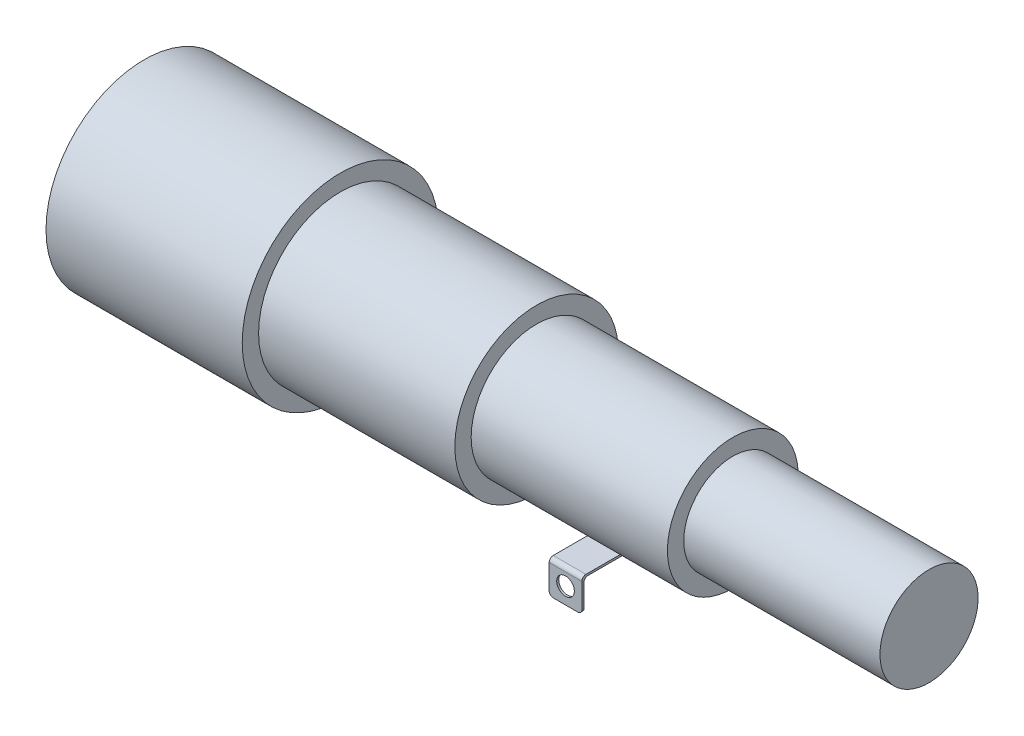
ISO-10303-21;
HEADER;
FILE_DESCRIPTION(('STEP AP214'),'2;1');
FILE_NAME('part.step','',(''),(''),'','','');
FILE_SCHEMA(('AUTOMOTIVE_DESIGN { 1 0 10303 214 1 1 1 1 }'));
ENDSEC;
DATA;
#1=APPLICATION_CONTEXT('core data for automotive mechanical design processes');
#2=APPLICATION_PROTOCOL_DEFINITION('international standard','automotive_design',2000,#1);
#3=PRODUCT_CONTEXT('',#1,'mechanical');
#4=PRODUCT('Part','Part','',(#3));
#5=PRODUCT_RELATED_PRODUCT_CATEGORY('part','',(#4));
#6=PRODUCT_DEFINITION_FORMATION('','',#4);
#7=PRODUCT_DEFINITION_CONTEXT('part definition',#1,'design');
#8=PRODUCT_DEFINITION('design','',#6,#7);
#9=PRODUCT_DEFINITION_SHAPE('','',#8);
#10=(LENGTH_UNIT() NAMED_UNIT(*) SI_UNIT(.MILLI.,.METRE.));
#11=(NAMED_UNIT(*) PLANE_ANGLE_UNIT() SI_UNIT($,.RADIAN.));
#12=(NAMED_UNIT(*) SI_UNIT($,.STERADIAN.) SOLID_ANGLE_UNIT());
#13=UNCERTAINTY_MEASURE_WITH_UNIT(LENGTH_MEASURE(1.E-05),#10,'distance_accuracy_value','');
#14=(GEOMETRIC_REPRESENTATION_CONTEXT(3) GLOBAL_UNCERTAINTY_ASSIGNED_CONTEXT((#13)) GLOBAL_UNIT_ASSIGNED_CONTEXT((#10,
#11,#12)) REPRESENTATION_CONTEXT('',''));
#15=CARTESIAN_POINT('',(0.,0.,0.));
#16=DIRECTION('',(0.,0.,1.));
#17=DIRECTION('',(1.,0.,0.));
#18=AXIS2_PLACEMENT_3D('',#15,#16,#17);
#19=CARTESIAN_POINT('',(730.633019333322,-104.775,98.298));
#20=DIRECTION('',(0.,0.,1.));
#21=DIRECTION('',(0.,-1.,0.));
#22=AXIS2_PLACEMENT_3D('',#19,#20,#21);
#23=PLANE('',#22);
#24=CARTESIAN_POINT('',(756.033019333322,-127.,98.2979999999999));
#25=DIRECTION('',(0.,0.,1.));
#26=DIRECTION('',(0.,-1.,0.));
#27=AXIS2_PLACEMENT_3D('',#24,#25,#26);
#28=CIRCLE('',#27,13.716);
#29=CARTESIAN_POINT('',(756.033019333322,-140.716,98.2979999999999));
#30=VERTEX_POINT('',#29);
#31=EDGE_CURVE('E328',#30,#30,#28,.T.);
#32=ORIENTED_EDGE('',*,*,#31,.T.);
#33=EDGE_LOOP('',(#32));
#34=FACE_BOUND('',#33,.T.);
#35=DIRECTION('',(0.,-1.,0.));
#36=VECTOR('',#35,1.);
#37=CARTESIAN_POINT('',(781.433019333322,-104.775,98.298));
#38=LINE('',#37,#36);
#39=CARTESIAN_POINT('',(781.433019333322,-111.125,98.298));
#40=VERTEX_POINT('',#39);
#41=CARTESIAN_POINT('',(781.433019333322,-146.05,98.2979999999999));
#42=VERTEX_POINT('',#41);
#43=EDGE_CURVE('E302',#40,#42,#38,.T.);
#44=ORIENTED_EDGE('',*,*,#43,.T.);
#45=CARTESIAN_POINT('',(775.083019333322,-146.05,98.2979999999999));
#46=DIRECTION('',(0.,0.,1.));
#47=DIRECTION('',(0.,-1.,0.));
#48=AXIS2_PLACEMENT_3D('',#45,#46,#47);
#49=CIRCLE('',#48,6.35);
#50=CARTESIAN_POINT('',(775.083019333322,-152.4,98.2979999999999));
#51=VERTEX_POINT('',#50);
#52=EDGE_CURVE('E357',#42,#51,#49,.F.);
#53=ORIENTED_EDGE('',*,*,#52,.T.);
#54=DIRECTION('',(1.,0.,0.));
#55=VECTOR('',#54,1.);
#56=CARTESIAN_POINT('',(730.633019333322,-152.4,98.2979999999999));
#57=LINE('',#56,#55);
#58=CARTESIAN_POINT('',(736.983019333322,-152.4,98.2979999999999));
#59=VERTEX_POINT('',#58);
#60=EDGE_CURVE('E235',#59,#51,#57,.T.);
#61=ORIENTED_EDGE('',*,*,#60,.F.);
#62=CARTESIAN_POINT('',(736.983019333322,-146.05,98.2979999999999));
#63=DIRECTION('',(0.,0.,1.));
#64=DIRECTION('',(0.,-1.,0.));
#65=AXIS2_PLACEMENT_3D('',#62,#63,#64);
#66=CIRCLE('',#65,6.35);
#67=CARTESIAN_POINT('',(730.633019333322,-146.05,98.2979999999999));
#68=VERTEX_POINT('',#67);
#69=EDGE_CURVE('E352',#59,#68,#66,.F.);
#70=ORIENTED_EDGE('',*,*,#69,.T.);
#71=DIRECTION('',(0.,-1.,0.));
#72=VECTOR('',#71,1.);
#73=CARTESIAN_POINT('',(730.633019333322,-104.775,98.298));
#74=LINE('',#73,#72);
#75=CARTESIAN_POINT('',(730.633019333322,-111.125,98.298));
#76=VERTEX_POINT('',#75);
#77=EDGE_CURVE('E336',#76,#68,#74,.T.);
#78=ORIENTED_EDGE('',*,*,#77,.F.);
#79=DIRECTION('',(1.,0.,0.));
#80=VECTOR('',#79,1.);
#81=CARTESIAN_POINT('',(781.433019333322,-111.125,98.2979999999999));
#82=LINE('',#81,#80);
#83=EDGE_CURVE('E346',#76,#40,#82,.T.);
#84=ORIENTED_EDGE('',*,*,#83,.T.);
#85=EDGE_LOOP('',(#44,#53,#61,#70,#78,#84));
#86=FACE_BOUND('',#85,.T.);
#87=ADVANCED_FACE('F56',(#34,#86),#23,.F.);
#88=CARTESIAN_POINT('',(730.633019333322,-152.4,98.2979999999999));
#89=DIRECTION('',(0.,1.,0.));
#90=DIRECTION('',(0.,0.,1.));
#91=AXIS2_PLACEMENT_3D('',#88,#89,#90);
#92=PLANE('',#91);
#93=ORIENTED_EDGE('',*,*,#60,.T.);
#94=DIRECTION('',(0.,0.,1.));
#95=VECTOR('',#94,1.);
#96=CARTESIAN_POINT('',(775.083019333322,-152.4,98.2979999999999));
#97=LINE('',#96,#95);
#98=CARTESIAN_POINT('',(775.083019333322,-152.4,101.473));
#99=VERTEX_POINT('',#98);
#100=EDGE_CURVE('E423',#51,#99,#97,.T.);
#101=ORIENTED_EDGE('',*,*,#100,.T.);
#102=DIRECTION('',(1.,0.,0.));
#103=VECTOR('',#102,1.);
#104=CARTESIAN_POINT('',(730.633019333322,-152.4,101.473));
#105=LINE('',#104,#103);
#106=CARTESIAN_POINT('',(736.983019333322,-152.4,101.473));
#107=VERTEX_POINT('',#106);
#108=EDGE_CURVE('E242',#107,#99,#105,.T.);
#109=ORIENTED_EDGE('',*,*,#108,.F.);
#110=DIRECTION('',(0.,0.,1.));
#111=VECTOR('',#110,1.);
#112=CARTESIAN_POINT('',(736.983019333322,-152.4,98.2979999999999));
#113=LINE('',#112,#111);
#114=EDGE_CURVE('E433',#107,#59,#113,.F.);
#115=ORIENTED_EDGE('',*,*,#114,.T.);
#116=EDGE_LOOP('',(#93,#101,#109,#115));
#117=FACE_BOUND('',#116,.T.);
#118=ADVANCED_FACE('F490',(#117),#92,.F.);
#119=CARTESIAN_POINT('',(730.633019333322,-101.6,101.473));
#120=DIRECTION('',(0.,0.,-1.));
#121=DIRECTION('',(0.,1.,0.));
#122=AXIS2_PLACEMENT_3D('',#119,#120,#121);
#123=PLANE('',#122);
#124=CARTESIAN_POINT('',(756.033019333322,-127.,101.473));
#125=DIRECTION('',(0.,0.,-1.));
#126=DIRECTION('',(0.,1.,0.));
#127=AXIS2_PLACEMENT_3D('',#124,#125,#126);
#128=CIRCLE('',#127,13.716);
#129=CARTESIAN_POINT('',(756.033019333322,-113.284,101.473));
#130=VERTEX_POINT('',#129);
#131=EDGE_CURVE('E334',#130,#130,#128,.T.);
#132=ORIENTED_EDGE('',*,*,#131,.T.);
#133=EDGE_LOOP('',(#132));
#134=FACE_BOUND('',#133,.T.);
#135=ORIENTED_EDGE('',*,*,#108,.T.);
#136=CARTESIAN_POINT('',(775.083019333322,-146.05,101.473));
#137=DIRECTION('',(0.,0.,-1.));
#138=DIRECTION('',(0.,1.,0.));
#139=AXIS2_PLACEMENT_3D('',#136,#137,#138);
#140=CIRCLE('',#139,6.35);
#141=CARTESIAN_POINT('',(781.433019333322,-146.05,101.473));
#142=VERTEX_POINT('',#141);
#143=EDGE_CURVE('E353',#99,#142,#140,.F.);
#144=ORIENTED_EDGE('',*,*,#143,.T.);
#145=DIRECTION('',(0.,1.,0.));
#146=VECTOR('',#145,1.);
#147=CARTESIAN_POINT('',(781.433019333322,-101.6,101.473));
#148=LINE('',#147,#146);
#149=CARTESIAN_POINT('',(781.433019333322,-107.95,101.473));
#150=VERTEX_POINT('',#149);
#151=EDGE_CURVE('E264',#142,#150,#148,.T.);
#152=ORIENTED_EDGE('',*,*,#151,.T.);
#153=DIRECTION('',(1.,0.,0.));
#154=VECTOR('',#153,1.);
#155=CARTESIAN_POINT('',(730.633019333322,-107.95,101.473));
#156=LINE('',#155,#154);
#157=CARTESIAN_POINT('',(730.633019333322,-107.95,101.473));
#158=VERTEX_POINT('',#157);
#159=EDGE_CURVE('E420',#150,#158,#156,.F.);
#160=ORIENTED_EDGE('',*,*,#159,.T.);
#161=DIRECTION('',(0.,1.,0.));
#162=VECTOR('',#161,1.);
#163=CARTESIAN_POINT('',(730.633019333322,-101.6,101.473));
#164=LINE('',#163,#162);
#165=CARTESIAN_POINT('',(730.633019333322,-146.05,101.473));
#166=VERTEX_POINT('',#165);
#167=EDGE_CURVE('E340',#166,#158,#164,.T.);
#168=ORIENTED_EDGE('',*,*,#167,.F.);
#169=CARTESIAN_POINT('',(736.983019333322,-146.05,101.473));
#170=DIRECTION('',(0.,0.,-1.));
#171=DIRECTION('',(0.,1.,0.));
#172=AXIS2_PLACEMENT_3D('',#169,#170,#171);
#173=CIRCLE('',#172,6.35);
#174=EDGE_CURVE('E422',#166,#107,#173,.F.);
#175=ORIENTED_EDGE('',*,*,#174,.T.);
#176=EDGE_LOOP('',(#135,#144,#152,#160,#168,#175));
#177=FACE_BOUND('',#176,.T.);
#178=ADVANCED_FACE('F456',(#134,#177),#123,.F.);
#179=CARTESIAN_POINT('',(730.633019333322,-101.6,101.473));
#180=DIRECTION('',(0.,-1.,0.));
#181=DIRECTION('',(0.,0.,-1.));
#182=AXIS2_PLACEMENT_3D('',#179,#180,#181);
#183=PLANE('',#182);
#184=DIRECTION('',(0.,0.,-1.));
#185=VECTOR('',#184,1.);
#186=CARTESIAN_POINT('',(781.433019333322,-101.6,101.473));
#187=LINE('',#186,#185);
#188=CARTESIAN_POINT('',(781.433019333322,-101.6,95.1229999999999));
#189=VERTEX_POINT('',#188);
#190=CARTESIAN_POINT('',(781.433019333322,-101.6,-95.1230000000001));
#191=VERTEX_POINT('',#190);
#192=EDGE_CURVE('E257',#189,#191,#187,.T.);
#193=ORIENTED_EDGE('',*,*,#192,.T.);
#194=DIRECTION('',(1.,0.,0.));
#195=VECTOR('',#194,1.);
#196=CARTESIAN_POINT('',(730.633019333322,-101.6,-95.1230000000001));
#197=LINE('',#196,#195);
#198=CARTESIAN_POINT('',(730.633019333322,-101.6,-95.1230000000001));
#199=VERTEX_POINT('',#198);
#200=EDGE_CURVE('E323',#191,#199,#197,.F.);
#201=ORIENTED_EDGE('',*,*,#200,.T.);
#202=DIRECTION('',(0.,0.,-1.));
#203=VECTOR('',#202,1.);
#204=CARTESIAN_POINT('',(730.633019333322,-101.6,101.473));
#205=LINE('',#204,#203);
#206=CARTESIAN_POINT('',(730.633019333322,-101.6,95.1229999999999));
#207=VERTEX_POINT('',#206);
#208=EDGE_CURVE('E391',#207,#199,#205,.T.);
#209=ORIENTED_EDGE('',*,*,#208,.F.);
#210=DIRECTION('',(1.,0.,0.));
#211=VECTOR('',#210,1.);
#212=CARTESIAN_POINT('',(730.633019333322,-101.6,95.1229999999999));
#213=LINE('',#212,#211);
#214=EDGE_CURVE('E317',#207,#189,#213,.T.);
#215=ORIENTED_EDGE('',*,*,#214,.T.);
#216=EDGE_LOOP('',(#193,#201,#209,#215));
#217=FACE_BOUND('',#216,.T.);
#218=ADVANCED_FACE('F390',(#217),#183,.F.);
#219=CARTESIAN_POINT('',(730.633019333322,-101.6,-101.473));
#220=DIRECTION('',(0.,0.,1.));
#221=DIRECTION('',(1.,0.,0.));
#222=AXIS2_PLACEMENT_3D('',#219,#220,#221);
#223=PLANE('',#222);
#224=CARTESIAN_POINT('',(756.033019333322,-127.,-101.473));
#225=DIRECTION('',(0.,0.,1.));
#226=DIRECTION('',(1.,0.,0.));
#227=AXIS2_PLACEMENT_3D('',#224,#225,#226);
#228=CIRCLE('',#227,13.716);
#229=CARTESIAN_POINT('',(769.749019333322,-127.,-101.473));
#230=VERTEX_POINT('',#229);
#231=EDGE_CURVE('E426',#230,#230,#228,.T.);
#232=ORIENTED_EDGE('',*,*,#231,.T.);
#233=EDGE_LOOP('',(#232));
#234=FACE_BOUND('',#233,.T.);
#235=DIRECTION('',(0.,-1.,0.));
#236=VECTOR('',#235,1.);
#237=CARTESIAN_POINT('',(781.433019333322,-101.6,-101.473));
#238=LINE('',#237,#236);
#239=CARTESIAN_POINT('',(781.433019333322,-107.95,-101.473));
#240=VERTEX_POINT('',#239);
#241=CARTESIAN_POINT('',(781.433019333322,-146.05,-101.473));
#242=VERTEX_POINT('',#241);
#243=EDGE_CURVE('E263',#240,#242,#238,.T.);
#244=ORIENTED_EDGE('',*,*,#243,.T.);
#245=CARTESIAN_POINT('',(775.083019333322,-146.05,-101.473));
#246=DIRECTION('',(0.,0.,1.));
#247=DIRECTION('',(1.,0.,0.));
#248=AXIS2_PLACEMENT_3D('',#245,#246,#247);
#249=CIRCLE('',#248,6.35);
#250=CARTESIAN_POINT('',(775.083019333322,-152.4,-101.473));
#251=VERTEX_POINT('',#250);
#252=EDGE_CURVE('E432',#242,#251,#249,.F.);
#253=ORIENTED_EDGE('',*,*,#252,.T.);
#254=DIRECTION('',(1.,0.,0.));
#255=VECTOR('',#254,1.);
#256=CARTESIAN_POINT('',(730.633019333322,-152.4,-101.473));
#257=LINE('',#256,#255);
#258=CARTESIAN_POINT('',(736.983019333322,-152.4,-101.473));
#259=VERTEX_POINT('',#258);
#260=EDGE_CURVE('E228',#259,#251,#257,.T.);
#261=ORIENTED_EDGE('',*,*,#260,.F.);
#262=CARTESIAN_POINT('',(736.983019333322,-146.05,-101.473));
#263=DIRECTION('',(0.,0.,1.));
#264=DIRECTION('',(1.,0.,0.));
#265=AXIS2_PLACEMENT_3D('',#262,#263,#264);
#266=CIRCLE('',#265,6.35);
#267=CARTESIAN_POINT('',(730.633019333322,-146.05,-101.473));
#268=VERTEX_POINT('',#267);
#269=EDGE_CURVE('E233',#259,#268,#266,.F.);
#270=ORIENTED_EDGE('',*,*,#269,.T.);
#271=DIRECTION('',(0.,-1.,0.));
#272=VECTOR('',#271,1.);
#273=CARTESIAN_POINT('',(730.633019333322,-101.6,-101.473));
#274=LINE('',#273,#272);
#275=CARTESIAN_POINT('',(730.633019333322,-107.95,-101.473));
#276=VERTEX_POINT('',#275);
#277=EDGE_CURVE('E298',#276,#268,#274,.T.);
#278=ORIENTED_EDGE('',*,*,#277,.F.);
#279=DIRECTION('',(1.,0.,0.));
#280=VECTOR('',#279,1.);
#281=CARTESIAN_POINT('',(730.633019333322,-107.95,-101.473));
#282=LINE('',#281,#280);
#283=EDGE_CURVE('E405',#276,#240,#282,.T.);
#284=ORIENTED_EDGE('',*,*,#283,.T.);
#285=EDGE_LOOP('',(#244,#253,#261,#270,#278,#284));
#286=FACE_BOUND('',#285,.T.);
#287=ADVANCED_FACE('F540',(#234,#286),#223,.F.);
#288=CARTESIAN_POINT('',(730.633019333322,-152.4,-98.2980000000001));
#289=DIRECTION('',(0.,1.,0.));
#290=DIRECTION('',(0.,0.,1.));
#291=AXIS2_PLACEMENT_3D('',#288,#289,#290);
#292=PLANE('',#291);
#293=ORIENTED_EDGE('',*,*,#260,.T.);
#294=DIRECTION('',(0.,0.,1.));
#295=VECTOR('',#294,1.);
#296=CARTESIAN_POINT('',(775.083019333322,-152.4,-98.2980000000001));
#297=LINE('',#296,#295);
#298=CARTESIAN_POINT('',(775.083019333322,-152.4,-98.2980000000001));
#299=VERTEX_POINT('',#298);
#300=EDGE_CURVE('E226',#251,#299,#297,.T.);
#301=ORIENTED_EDGE('',*,*,#300,.T.);
#302=DIRECTION('',(1.,0.,0.));
#303=VECTOR('',#302,1.);
#304=CARTESIAN_POINT('',(730.633019333322,-152.4,-98.2980000000001));
#305=LINE('',#304,#303);
#306=CARTESIAN_POINT('',(736.983019333322,-152.4,-98.2980000000001));
#307=VERTEX_POINT('',#306);
#308=EDGE_CURVE('E209',#307,#299,#305,.T.);
#309=ORIENTED_EDGE('',*,*,#308,.F.);
#310=DIRECTION('',(0.,0.,1.));
#311=VECTOR('',#310,1.);
#312=CARTESIAN_POINT('',(736.983019333322,-152.4,-101.473));
#313=LINE('',#312,#311);
#314=EDGE_CURVE('E223',#307,#259,#313,.F.);
#315=ORIENTED_EDGE('',*,*,#314,.T.);
#316=EDGE_LOOP('',(#293,#301,#309,#315));
#317=FACE_BOUND('',#316,.T.);
#318=ADVANCED_FACE('F222',(#317),#292,.F.);
#319=CARTESIAN_POINT('',(730.633019333322,-104.775,-98.2980000000001));
#320=DIRECTION('',(0.,0.,-1.));
#321=DIRECTION('',(-1.,0.,0.));
#322=AXIS2_PLACEMENT_3D('',#319,#320,#321);
#323=PLANE('',#322);
#324=CARTESIAN_POINT('',(756.033019333322,-127.,-98.2980000000001));
#325=DIRECTION('',(0.,0.,-1.));
#326=DIRECTION('',(-1.,0.,0.));
#327=AXIS2_PLACEMENT_3D('',#324,#325,#326);
#328=CIRCLE('',#327,13.716);
#329=CARTESIAN_POINT('',(742.317019333322,-127.,-98.2980000000001));
#330=VERTEX_POINT('',#329);
#331=EDGE_CURVE('E61',#330,#330,#328,.T.);
#332=ORIENTED_EDGE('',*,*,#331,.T.);
#333=EDGE_LOOP('',(#332));
#334=FACE_BOUND('',#333,.T.);
#335=ORIENTED_EDGE('',*,*,#308,.T.);
#336=CARTESIAN_POINT('',(775.083019333322,-146.05,-98.2980000000001));
#337=DIRECTION('',(0.,0.,-1.));
#338=DIRECTION('',(-1.,0.,0.));
#339=AXIS2_PLACEMENT_3D('',#336,#337,#338);
#340=CIRCLE('',#339,6.35);
#341=CARTESIAN_POINT('',(781.433019333322,-146.05,-98.2980000000001));
#342=VERTEX_POINT('',#341);
#343=EDGE_CURVE('E216',#299,#342,#340,.F.);
#344=ORIENTED_EDGE('',*,*,#343,.T.);
#345=DIRECTION('',(0.,1.,0.));
#346=VECTOR('',#345,1.);
#347=CARTESIAN_POINT('',(781.433019333322,-104.775,-98.2980000000001));
#348=LINE('',#347,#346);
#349=CARTESIAN_POINT('',(781.433019333322,-111.125,-98.2980000000001));
#350=VERTEX_POINT('',#349);
#351=EDGE_CURVE('E271',#342,#350,#348,.T.);
#352=ORIENTED_EDGE('',*,*,#351,.T.);
#353=DIRECTION('',(1.,0.,0.));
#354=VECTOR('',#353,1.);
#355=CARTESIAN_POINT('',(730.633019333322,-111.125,-98.2980000000001));
#356=LINE('',#355,#354);
#357=CARTESIAN_POINT('',(730.633019333322,-111.125,-98.2980000000001));
#358=VERTEX_POINT('',#357);
#359=EDGE_CURVE('E217',#350,#358,#356,.F.);
#360=ORIENTED_EDGE('',*,*,#359,.T.);
#361=DIRECTION('',(0.,1.,0.));
#362=VECTOR('',#361,1.);
#363=CARTESIAN_POINT('',(730.633019333322,-104.775,-98.2980000000001));
#364=LINE('',#363,#362);
#365=CARTESIAN_POINT('',(730.633019333322,-146.05,-98.2980000000001));
#366=VERTEX_POINT('',#365);
#367=EDGE_CURVE('E210',#366,#358,#364,.T.);
#368=ORIENTED_EDGE('',*,*,#367,.F.);
#369=CARTESIAN_POINT('',(736.983019333322,-146.05,-98.2980000000001));
#370=DIRECTION('',(0.,0.,-1.));
#371=DIRECTION('',(-1.,0.,0.));
#372=AXIS2_PLACEMENT_3D('',#369,#370,#371);
#373=CIRCLE('',#372,6.35);
#374=EDGE_CURVE('E206',#366,#307,#373,.F.);
#375=ORIENTED_EDGE('',*,*,#374,.T.);
#376=EDGE_LOOP('',(#335,#344,#352,#360,#368,#375));
#377=FACE_BOUND('',#376,.T.);
#378=ADVANCED_FACE('F208',(#334,#377),#323,.F.);
#379=CARTESIAN_POINT('',(730.633019333322,-104.775,98.298));
#380=DIRECTION('',(0.,1.,0.));
#381=DIRECTION('',(0.,0.,1.));
#382=AXIS2_PLACEMENT_3D('',#379,#380,#381);
#383=PLANE('',#382);
#384=DIRECTION('',(0.,0.,1.));
#385=VECTOR('',#384,1.);
#386=CARTESIAN_POINT('',(730.633019333322,-104.775,98.298));
#387=LINE('',#386,#385);
#388=CARTESIAN_POINT('',(730.633019333322,-104.775,-91.9480000000001));
#389=VERTEX_POINT('',#388);
#390=CARTESIAN_POINT('',(730.633019333322,-104.775,91.948));
#391=VERTEX_POINT('',#390);
#392=EDGE_CURVE('E229',#389,#391,#387,.T.);
#393=ORIENTED_EDGE('',*,*,#392,.F.);
#394=DIRECTION('',(1.,0.,0.));
#395=VECTOR('',#394,1.);
#396=CARTESIAN_POINT('',(781.433019333322,-104.775,-91.9480000000001));
#397=LINE('',#396,#395);
#398=CARTESIAN_POINT('',(781.433019333322,-104.775,-91.9480000000001));
#399=VERTEX_POINT('',#398);
#400=EDGE_CURVE('E312',#389,#399,#397,.T.);
#401=ORIENTED_EDGE('',*,*,#400,.T.);
#402=DIRECTION('',(0.,0.,1.));
#403=VECTOR('',#402,1.);
#404=CARTESIAN_POINT('',(781.433019333322,-104.775,98.298));
#405=LINE('',#404,#403);
#406=CARTESIAN_POINT('',(781.433019333322,-104.775,91.948));
#407=VERTEX_POINT('',#406);
#408=EDGE_CURVE('E341',#399,#407,#405,.T.);
#409=ORIENTED_EDGE('',*,*,#408,.T.);
#410=DIRECTION('',(1.,0.,0.));
#411=VECTOR('',#410,1.);
#412=CARTESIAN_POINT('',(730.633019333322,-104.775,91.948));
#413=LINE('',#412,#411);
#414=EDGE_CURVE('E78',#407,#391,#413,.F.);
#415=ORIENTED_EDGE('',*,*,#414,.T.);
#416=EDGE_LOOP('',(#393,#401,#409,#415));
#417=FACE_BOUND('',#416,.T.);
#418=ADVANCED_FACE('F482',(#417),#383,.F.);
#419=CARTESIAN_POINT('',(730.633019333322,0.,0.));
#420=DIRECTION('',(-1.,0.,0.));
#421=DIRECTION('',(0.,0.,1.));
#422=AXIS2_PLACEMENT_3D('',#419,#420,#421);
#423=PLANE('',#422);
#424=ORIENTED_EDGE('',*,*,#277,.T.);
#425=DIRECTION('',(0.,0.,1.));
#426=VECTOR('',#425,1.);
#427=CARTESIAN_POINT('',(730.633019333322,-146.05,-98.2980000000001));
#428=LINE('',#427,#426);
#429=EDGE_CURVE('E411',#268,#366,#428,.T.);
#430=ORIENTED_EDGE('',*,*,#429,.T.);
#431=ORIENTED_EDGE('',*,*,#367,.T.);
#432=CARTESIAN_POINT('',(730.633019333322,-111.125,-91.9480000000001));
#433=DIRECTION('',(-1.,0.,0.));
#434=DIRECTION('',(0.,0.,1.));
#435=AXIS2_PLACEMENT_3D('',#432,#433,#434);
#436=CIRCLE('',#435,6.35);
#437=EDGE_CURVE('E86',#358,#389,#436,.F.);
#438=ORIENTED_EDGE('',*,*,#437,.T.);
#439=ORIENTED_EDGE('',*,*,#392,.T.);
#440=CARTESIAN_POINT('',(730.633019333322,-111.125,91.948));
#441=DIRECTION('',(-1.,0.,0.));
#442=DIRECTION('',(0.,0.,1.));
#443=AXIS2_PLACEMENT_3D('',#440,#441,#442);
#444=CIRCLE('',#443,6.35);
#445=EDGE_CURVE('E13',#391,#76,#444,.F.);
#446=ORIENTED_EDGE('',*,*,#445,.T.);
#447=ORIENTED_EDGE('',*,*,#77,.T.);
#448=DIRECTION('',(0.,0.,1.));
#449=VECTOR('',#448,1.);
#450=CARTESIAN_POINT('',(730.633019333322,-146.05,101.473));
#451=LINE('',#450,#449);
#452=EDGE_CURVE('E407',#68,#166,#451,.T.);
#453=ORIENTED_EDGE('',*,*,#452,.T.);
#454=ORIENTED_EDGE('',*,*,#167,.T.);
#455=CARTESIAN_POINT('',(730.633019333322,-107.95,95.1229999999999));
#456=DIRECTION('',(-1.,0.,0.));
#457=DIRECTION('',(0.,0.,1.));
#458=AXIS2_PLACEMENT_3D('',#455,#456,#457);
#459=CIRCLE('',#458,6.35);
#460=EDGE_CURVE('E360',#158,#207,#459,.T.);
#461=ORIENTED_EDGE('',*,*,#460,.T.);
#462=ORIENTED_EDGE('',*,*,#208,.T.);
#463=CARTESIAN_POINT('',(730.633019333322,-107.95,-95.1230000000001));
#464=DIRECTION('',(-1.,0.,0.));
#465=DIRECTION('',(0.,0.,1.));
#466=AXIS2_PLACEMENT_3D('',#463,#464,#465);
#467=CIRCLE('',#466,6.35);
#468=EDGE_CURVE('E364',#199,#276,#467,.T.);
#469=ORIENTED_EDGE('',*,*,#468,.T.);
#470=EDGE_LOOP('',(#424,#430,#431,#438,#439,#446,#447,#453,#454,#461,#462,#469));
#471=FACE_BOUND('',#470,.T.);
#472=ADVANCED_FACE('F397',(#471),#423,.T.);
#473=CARTESIAN_POINT('',(781.433019333322,0.,0.));
#474=DIRECTION('',(-1.,0.,0.));
#475=DIRECTION('',(0.,0.,1.));
#476=AXIS2_PLACEMENT_3D('',#473,#474,#475);
#477=PLANE('',#476);
#478=ORIENTED_EDGE('',*,*,#351,.F.);
#479=DIRECTION('',(0.,0.,1.));
#480=VECTOR('',#479,1.);
#481=CARTESIAN_POINT('',(781.433019333322,-146.049999999999,1.27364587544909E-12));
#482=LINE('',#481,#480);
#483=EDGE_CURVE('E439',#342,#242,#482,.F.);
#484=ORIENTED_EDGE('',*,*,#483,.T.);
#485=ORIENTED_EDGE('',*,*,#243,.F.);
#486=CARTESIAN_POINT('',(781.433019333322,-107.95,-95.1230000000001));
#487=DIRECTION('',(-1.,0.,0.));
#488=DIRECTION('',(0.,0.,1.));
#489=AXIS2_PLACEMENT_3D('',#486,#487,#488);
#490=CIRCLE('',#489,6.35);
#491=EDGE_CURVE('E468',#240,#191,#490,.F.);
#492=ORIENTED_EDGE('',*,*,#491,.T.);
#493=ORIENTED_EDGE('',*,*,#192,.F.);
#494=CARTESIAN_POINT('',(781.433019333322,-107.95,95.1229999999999));
#495=DIRECTION('',(-1.,0.,0.));
#496=DIRECTION('',(0.,0.,1.));
#497=AXIS2_PLACEMENT_3D('',#494,#495,#496);
#498=CIRCLE('',#497,6.35);
#499=EDGE_CURVE('E429',#189,#150,#498,.F.);
#500=ORIENTED_EDGE('',*,*,#499,.T.);
#501=ORIENTED_EDGE('',*,*,#151,.F.);
#502=DIRECTION('',(0.,0.,1.));
#503=VECTOR('',#502,1.);
#504=CARTESIAN_POINT('',(781.433019333322,-146.05,0.));
#505=LINE('',#504,#503);
#506=EDGE_CURVE('E443',#142,#42,#505,.F.);
#507=ORIENTED_EDGE('',*,*,#506,.T.);
#508=ORIENTED_EDGE('',*,*,#43,.F.);
#509=CARTESIAN_POINT('',(781.433019333322,-111.125,91.948));
#510=DIRECTION('',(-1.,0.,0.));
#511=DIRECTION('',(0.,0.,1.));
#512=AXIS2_PLACEMENT_3D('',#509,#510,#511);
#513=CIRCLE('',#512,6.35);
#514=EDGE_CURVE('E68',#40,#407,#513,.T.);
#515=ORIENTED_EDGE('',*,*,#514,.T.);
#516=ORIENTED_EDGE('',*,*,#408,.F.);
#517=CARTESIAN_POINT('',(781.433019333322,-111.125,-91.9480000000001));
#518=DIRECTION('',(-1.,0.,0.));
#519=DIRECTION('',(0.,0.,1.));
#520=AXIS2_PLACEMENT_3D('',#517,#518,#519);
#521=CIRCLE('',#520,6.35);
#522=EDGE_CURVE('E375',#399,#350,#521,.T.);
#523=ORIENTED_EDGE('',*,*,#522,.T.);
#524=EDGE_LOOP('',(#478,#484,#485,#492,#493,#500,#501,#507,#508,#515,#516,#523));
#525=FACE_BOUND('',#524,.T.);
#526=ADVANCED_FACE('F461',(#525),#477,.F.);
#527=CARTESIAN_POINT('',(775.083019333322,-146.05,-98.2980000000001));
#528=DIRECTION('',(0.,0.,1.));
#529=DIRECTION('',(0.,-1.,0.));
#530=AXIS2_PLACEMENT_3D('',#527,#528,#529);
#531=CYLINDRICAL_SURFACE('',#530,6.35);
#532=ORIENTED_EDGE('',*,*,#252,.F.);
#533=ORIENTED_EDGE('',*,*,#483,.F.);
#534=ORIENTED_EDGE('',*,*,#343,.F.);
#535=ORIENTED_EDGE('',*,*,#300,.F.);
#536=EDGE_LOOP('',(#532,#533,#534,#535));
#537=FACE_BOUND('',#536,.T.);
#538=ADVANCED_FACE('F509',(#537),#531,.T.);
#539=CARTESIAN_POINT('',(775.083019333322,-146.05,98.2979999999999));
#540=DIRECTION('',(0.,0.,1.));
#541=DIRECTION('',(1.,0.,0.));
#542=AXIS2_PLACEMENT_3D('',#539,#540,#541);
#543=CYLINDRICAL_SURFACE('',#542,6.35);
#544=ORIENTED_EDGE('',*,*,#52,.F.);
#545=ORIENTED_EDGE('',*,*,#506,.F.);
#546=ORIENTED_EDGE('',*,*,#143,.F.);
#547=ORIENTED_EDGE('',*,*,#100,.F.);
#548=EDGE_LOOP('',(#544,#545,#546,#547));
#549=FACE_BOUND('',#548,.T.);
#550=ADVANCED_FACE('F466',(#549),#543,.T.);
#551=CARTESIAN_POINT('',(736.983019333322,-146.049999999999,1.27986708118876E-12));
#552=DIRECTION('',(0.,0.,-1.));
#553=DIRECTION('',(0.,1.,0.));
#554=AXIS2_PLACEMENT_3D('',#551,#552,#553);
#555=CYLINDRICAL_SURFACE('',#554,6.35);
#556=ORIENTED_EDGE('',*,*,#269,.F.);
#557=ORIENTED_EDGE('',*,*,#314,.F.);
#558=ORIENTED_EDGE('',*,*,#374,.F.);
#559=ORIENTED_EDGE('',*,*,#429,.F.);
#560=EDGE_LOOP('',(#556,#557,#558,#559));
#561=FACE_BOUND('',#560,.T.);
#562=ADVANCED_FACE('F232',(#561),#555,.T.);
#563=CARTESIAN_POINT('',(736.983019333322,-146.05,0.));
#564=DIRECTION('',(0.,0.,-1.));
#565=DIRECTION('',(-1.,0.,0.));
#566=AXIS2_PLACEMENT_3D('',#563,#564,#565);
#567=CYLINDRICAL_SURFACE('',#566,6.35);
#568=ORIENTED_EDGE('',*,*,#69,.F.);
#569=ORIENTED_EDGE('',*,*,#114,.F.);
#570=ORIENTED_EDGE('',*,*,#174,.F.);
#571=ORIENTED_EDGE('',*,*,#452,.F.);
#572=EDGE_LOOP('',(#568,#569,#570,#571));
#573=FACE_BOUND('',#572,.T.);
#574=ADVANCED_FACE('F488',(#573),#567,.T.);
#575=CARTESIAN_POINT('',(730.633019333322,-111.125,-91.9480000000001));
#576=DIRECTION('',(-1.,0.,0.));
#577=DIRECTION('',(0.,0.,1.));
#578=AXIS2_PLACEMENT_3D('',#575,#576,#577);
#579=CYLINDRICAL_SURFACE('',#578,6.35);
#580=ORIENTED_EDGE('',*,*,#437,.F.);
#581=ORIENTED_EDGE('',*,*,#359,.F.);
#582=ORIENTED_EDGE('',*,*,#522,.F.);
#583=ORIENTED_EDGE('',*,*,#400,.F.);
#584=EDGE_LOOP('',(#580,#581,#582,#583));
#585=FACE_BOUND('',#584,.T.);
#586=ADVANCED_FACE('F524',(#585),#579,.F.);
#587=CARTESIAN_POINT('',(730.633019333322,-107.95,-95.1230000000001));
#588=DIRECTION('',(1.,0.,0.));
#589=DIRECTION('',(0.,0.,-1.));
#590=AXIS2_PLACEMENT_3D('',#587,#588,#589);
#591=CYLINDRICAL_SURFACE('',#590,6.35);
#592=ORIENTED_EDGE('',*,*,#468,.F.);
#593=ORIENTED_EDGE('',*,*,#200,.F.);
#594=ORIENTED_EDGE('',*,*,#491,.F.);
#595=ORIENTED_EDGE('',*,*,#283,.F.);
#596=EDGE_LOOP('',(#592,#593,#594,#595));
#597=FACE_BOUND('',#596,.T.);
#598=ADVANCED_FACE('F403',(#597),#591,.T.);
#599=CARTESIAN_POINT('',(730.633019333322,-107.95,95.1229999999999));
#600=DIRECTION('',(1.,0.,0.));
#601=DIRECTION('',(0.,0.,-1.));
#602=AXIS2_PLACEMENT_3D('',#599,#600,#601);
#603=CYLINDRICAL_SURFACE('',#602,6.35);
#604=ORIENTED_EDGE('',*,*,#460,.F.);
#605=ORIENTED_EDGE('',*,*,#159,.F.);
#606=ORIENTED_EDGE('',*,*,#499,.F.);
#607=ORIENTED_EDGE('',*,*,#214,.F.);
#608=EDGE_LOOP('',(#604,#605,#606,#607));
#609=FACE_BOUND('',#608,.T.);
#610=ADVANCED_FACE('F531',(#609),#603,.T.);
#611=CARTESIAN_POINT('',(730.633019333322,-111.125,91.948));
#612=DIRECTION('',(-1.,0.,0.));
#613=DIRECTION('',(0.,0.,1.));
#614=AXIS2_PLACEMENT_3D('',#611,#612,#613);
#615=CYLINDRICAL_SURFACE('',#614,6.35);
#616=ORIENTED_EDGE('',*,*,#445,.F.);
#617=ORIENTED_EDGE('',*,*,#414,.F.);
#618=ORIENTED_EDGE('',*,*,#514,.F.);
#619=ORIENTED_EDGE('',*,*,#83,.F.);
#620=EDGE_LOOP('',(#616,#617,#618,#619));
#621=FACE_BOUND('',#620,.T.);
#622=ADVANCED_FACE('F59',(#621),#615,.F.);
#623=CARTESIAN_POINT('',(756.033019333322,-127.,-152.4));
#624=DIRECTION('',(0.,0.,1.));
#625=DIRECTION('',(1.,0.,0.));
#626=AXIS2_PLACEMENT_3D('',#623,#624,#625);
#627=CYLINDRICAL_SURFACE('',#626,13.716);
#628=ORIENTED_EDGE('',*,*,#331,.F.);
#629=EDGE_LOOP('',(#628));
#630=FACE_BOUND('',#629,.T.);
#631=ORIENTED_EDGE('',*,*,#231,.F.);
#632=EDGE_LOOP('',(#631));
#633=FACE_BOUND('',#632,.T.);
#634=ADVANCED_FACE('F537',(#630,#633),#627,.F.);
#635=ORIENTED_EDGE('',*,*,#131,.F.);
#636=EDGE_LOOP('',(#635));
#637=FACE_BOUND('',#636,.T.);
#638=ORIENTED_EDGE('',*,*,#31,.F.);
#639=EDGE_LOOP('',(#638));
#640=FACE_BOUND('',#639,.T.);
#641=ADVANCED_FACE('F565',(#637,#640),#627,.F.);
#642=CLOSED_SHELL('',(#87,#118,#178,#218,#287,#318,#378,#418,#472,#526,#538,#550,#562,#574,#586,
#598,#610,#622,#634,#641));
#643=MANIFOLD_SOLID_BREP('B2',#642);
#644=CARTESIAN_POINT('',(304.8,0.,0.));
#645=DIRECTION('',(-1.,0.,0.));
#646=DIRECTION('',(0.,0.,1.));
#647=AXIS2_PLACEMENT_3D('',#644,#645,#646);
#648=CYLINDRICAL_SURFACE('',#647,152.4);
#649=CARTESIAN_POINT('',(304.8,0.,0.));
#650=DIRECTION('',(1.,0.,0.));
#651=DIRECTION('',(0.,0.,-1.));
#652=AXIS2_PLACEMENT_3D('',#649,#650,#651);
#653=CIRCLE('',#652,152.4);
#654=CARTESIAN_POINT('',(304.8,0.,152.4));
#655=VERTEX_POINT('',#654);
#656=EDGE_CURVE('E758',#655,#655,#653,.T.);
#657=CARTESIAN_POINT('',(0.,0.,0.));
#658=DIRECTION('',(1.,0.,0.));
#659=DIRECTION('',(0.,0.,-1.));
#660=AXIS2_PLACEMENT_3D('',#657,#658,#659);
#661=CIRCLE('',#660,152.4);
#662=CARTESIAN_POINT('',(0.,0.,152.4));
#663=VERTEX_POINT('',#662);
#664=EDGE_CURVE('E722',#663,#663,#661,.T.);
#665=CARTESIAN_POINT('',(304.8,0.,152.4));
#666=CARTESIAN_POINT('',(301.625,0.,152.4));
#667=CARTESIAN_POINT('',(298.45,0.,152.4));
#668=CARTESIAN_POINT('',(292.1,0.,152.4));
#669=CARTESIAN_POINT('',(288.925,0.,152.4));
#670=CARTESIAN_POINT('',(282.575,0.,152.4));
#671=CARTESIAN_POINT('',(279.4,0.,152.4));
#672=CARTESIAN_POINT('',(273.05,0.,152.4));
#673=CARTESIAN_POINT('',(269.875,0.,152.4));
#674=CARTESIAN_POINT('',(263.525,0.,152.4));
#675=CARTESIAN_POINT('',(260.35,0.,152.4));
#676=CARTESIAN_POINT('',(254.,0.,152.4));
#677=CARTESIAN_POINT('',(250.825,0.,152.4));
#678=CARTESIAN_POINT('',(244.475,0.,152.4));
#679=CARTESIAN_POINT('',(241.3,0.,152.4));
#680=CARTESIAN_POINT('',(234.95,0.,152.4));
#681=CARTESIAN_POINT('',(231.775,0.,152.4));
#682=CARTESIAN_POINT('',(225.425,0.,152.4));
#683=CARTESIAN_POINT('',(222.25,0.,152.4));
#684=CARTESIAN_POINT('',(215.9,0.,152.4));
#685=CARTESIAN_POINT('',(212.725,0.,152.4));
#686=CARTESIAN_POINT('',(206.375,0.,152.4));
#687=CARTESIAN_POINT('',(203.2,0.,152.4));
#688=CARTESIAN_POINT('',(196.85,0.,152.4));
#689=CARTESIAN_POINT('',(193.675,0.,152.4));
#690=CARTESIAN_POINT('',(187.325,0.,152.4));
#691=CARTESIAN_POINT('',(184.15,0.,152.4));
#692=CARTESIAN_POINT('',(177.8,0.,152.4));
#693=CARTESIAN_POINT('',(174.625,0.,152.4));
#694=CARTESIAN_POINT('',(168.275,0.,152.4));
#695=CARTESIAN_POINT('',(165.1,0.,152.4));
#696=CARTESIAN_POINT('',(158.75,0.,152.4));
#697=CARTESIAN_POINT('',(155.575,0.,152.4));
#698=CARTESIAN_POINT('',(149.225,0.,152.4));
#699=CARTESIAN_POINT('',(146.05,0.,152.4));
#700=CARTESIAN_POINT('',(139.7,0.,152.4));
#701=CARTESIAN_POINT('',(136.525,0.,152.4));
#702=CARTESIAN_POINT('',(130.175,0.,152.4));
#703=CARTESIAN_POINT('',(127.,0.,152.4));
#704=CARTESIAN_POINT('',(120.65,0.,152.4));
#705=CARTESIAN_POINT('',(117.475,0.,152.4));
#706=CARTESIAN_POINT('',(111.125,0.,152.4));
#707=CARTESIAN_POINT('',(107.95,0.,152.4));
#708=CARTESIAN_POINT('',(101.6,0.,152.4));
#709=CARTESIAN_POINT('',(98.425,0.,152.4));
#710=CARTESIAN_POINT('',(92.075,0.,152.4));
#711=CARTESIAN_POINT('',(88.9,0.,152.4));
#712=CARTESIAN_POINT('',(82.55,0.,152.4));
#713=CARTESIAN_POINT('',(79.375,0.,152.4));
#714=CARTESIAN_POINT('',(73.025,0.,152.4));
#715=CARTESIAN_POINT('',(69.85,0.,152.4));
#716=CARTESIAN_POINT('',(63.5,0.,152.4));
#717=CARTESIAN_POINT('',(60.325,0.,152.4));
#718=CARTESIAN_POINT('',(53.975,0.,152.4));
#719=CARTESIAN_POINT('',(50.8,0.,152.4));
#720=CARTESIAN_POINT('',(44.45,0.,152.4));
#721=CARTESIAN_POINT('',(41.275,0.,152.4));
#722=CARTESIAN_POINT('',(34.925,0.,152.4));
#723=CARTESIAN_POINT('',(31.75,0.,152.4));
#724=CARTESIAN_POINT('',(25.4,0.,152.4));
#725=CARTESIAN_POINT('',(22.225,0.,152.4));
#726=CARTESIAN_POINT('',(15.875,0.,152.4));
#727=CARTESIAN_POINT('',(12.7,0.,152.4));
#728=CARTESIAN_POINT('',(6.35,0.,152.4));
#729=CARTESIAN_POINT('',(3.175,0.,152.4));
#730=CARTESIAN_POINT('',(0.,0.,152.4));
#731=B_SPLINE_CURVE_WITH_KNOTS('',3,(#665,#666,#667,#668,#669,#670,#671,#672,#673,#674,#675,
#676,#677,#678,#679,#680,#681,#682,#683,#684,#685,#686,#687,#688,#689,#690,#691,#692,#693,#694,
#695,#696,#697,#698,#699,#700,#701,#702,#703,#704,#705,#706,#707,#708,#709,#710,#711,#712,#713,
#714,#715,#716,#717,#718,#719,#720,#721,#722,#723,#724,#725,#726,#727,#728,#729,#730),
.UNSPECIFIED.,.F.,.F.,(4,2,2,2,2,2,2,2,2,2,2,2,2,2,2,2,2,2,2,2,2,2,2,2,2,2,2,2,2,2,2,2,4),(0.,
9.52500000000001,19.05,28.575,38.1,47.625,57.15,66.675,76.2,85.7250000000001,95.2500000000001,
104.775,114.3,123.825,133.35,142.875,152.4,161.925,171.45,180.975,190.5,200.025,209.55,219.075,
228.6,238.125,247.65,257.175,266.7,276.225,285.75,295.275,304.8),.UNSPECIFIED.);
#732=EDGE_CURVE('BSEAM718',#655,#663,#731,.T.);
#733=ORIENTED_EDGE('',*,*,#656,.F.);
#734=ORIENTED_EDGE('',*,*,#664,.T.);
#735=ORIENTED_EDGE('',*,*,#732,.T.);
#736=ORIENTED_EDGE('',*,*,#732,.F.);
#737=EDGE_LOOP('',(#733,#735,#734,#736));
#738=FACE_BOUND('',#737,.T.);
#739=ADVANCED_FACE('F718',(#738),#648,.T.);
#740=CARTESIAN_POINT('',(304.8,0.,0.));
#741=DIRECTION('',(1.,0.,0.));
#742=DIRECTION('',(0.,0.,-1.));
#743=AXIS2_PLACEMENT_3D('',#740,#741,#742);
#744=PLANE('',#743);
#745=CARTESIAN_POINT('',(304.8,0.,0.));
#746=DIRECTION('',(1.,0.,0.));
#747=DIRECTION('',(0.,0.,-1.));
#748=AXIS2_PLACEMENT_3D('',#745,#746,#747);
#749=CIRCLE('',#748,127.);
#750=CARTESIAN_POINT('',(304.8,0.,127.));
#751=VERTEX_POINT('',#750);
#752=EDGE_CURVE('E736',#751,#751,#749,.T.);
#753=ORIENTED_EDGE('',*,*,#752,.F.);
#754=EDGE_LOOP('',(#753));
#755=FACE_BOUND('',#754,.T.);
#756=ORIENTED_EDGE('',*,*,#656,.T.);
#757=EDGE_LOOP('',(#756));
#758=FACE_BOUND('',#757,.T.);
#759=ADVANCED_FACE('F774',(#755,#758),#744,.T.);
#760=CARTESIAN_POINT('',(0.,0.,0.));
#761=DIRECTION('',(1.,0.,0.));
#762=DIRECTION('',(0.,0.,-1.));
#763=AXIS2_PLACEMENT_3D('',#760,#761,#762);
#764=PLANE('',#763);
#765=ORIENTED_EDGE('',*,*,#664,.F.);
#766=EDGE_LOOP('',(#765));
#767=FACE_BOUND('',#766,.T.);
#768=ADVANCED_FACE('F771',(#767),#764,.F.);
#769=CARTESIAN_POINT('',(609.6,0.,0.));
#770=DIRECTION('',(-1.,0.,0.));
#771=DIRECTION('',(0.,0.,1.));
#772=AXIS2_PLACEMENT_3D('',#769,#770,#771);
#773=CYLINDRICAL_SURFACE('',#772,127.);
#774=CARTESIAN_POINT('',(609.6,0.,0.));
#775=DIRECTION('',(1.,0.,0.));
#776=DIRECTION('',(0.,0.,-1.));
#777=AXIS2_PLACEMENT_3D('',#774,#775,#776);
#778=CIRCLE('',#777,127.);
#779=CARTESIAN_POINT('',(609.6,0.,127.));
#780=VERTEX_POINT('',#779);
#781=EDGE_CURVE('E750',#780,#780,#778,.T.);
#782=CARTESIAN_POINT('',(609.6,0.,127.));
#783=CARTESIAN_POINT('',(606.425,0.,127.));
#784=CARTESIAN_POINT('',(603.25,0.,127.));
#785=CARTESIAN_POINT('',(596.9,0.,127.));
#786=CARTESIAN_POINT('',(593.725,0.,127.));
#787=CARTESIAN_POINT('',(587.375,0.,127.));
#788=CARTESIAN_POINT('',(584.2,0.,127.));
#789=CARTESIAN_POINT('',(577.85,0.,127.));
#790=CARTESIAN_POINT('',(574.675,0.,127.));
#791=CARTESIAN_POINT('',(568.325,0.,127.));
#792=CARTESIAN_POINT('',(565.15,0.,127.));
#793=CARTESIAN_POINT('',(558.8,0.,127.));
#794=CARTESIAN_POINT('',(555.625,0.,127.));
#795=CARTESIAN_POINT('',(549.275,0.,127.));
#796=CARTESIAN_POINT('',(546.1,0.,127.));
#797=CARTESIAN_POINT('',(539.75,0.,127.));
#798=CARTESIAN_POINT('',(536.575,0.,127.));
#799=CARTESIAN_POINT('',(530.225,0.,127.));
#800=CARTESIAN_POINT('',(527.05,0.,127.));
#801=CARTESIAN_POINT('',(520.7,0.,127.));
#802=CARTESIAN_POINT('',(517.525,0.,127.));
#803=CARTESIAN_POINT('',(511.175,0.,127.));
#804=CARTESIAN_POINT('',(508.,0.,127.));
#805=CARTESIAN_POINT('',(501.65,0.,127.));
#806=CARTESIAN_POINT('',(498.475,0.,127.));
#807=CARTESIAN_POINT('',(492.125,0.,127.));
#808=CARTESIAN_POINT('',(488.95,0.,127.));
#809=CARTESIAN_POINT('',(482.6,0.,127.));
#810=CARTESIAN_POINT('',(479.425,0.,127.));
#811=CARTESIAN_POINT('',(473.075,0.,127.));
#812=CARTESIAN_POINT('',(469.9,0.,127.));
#813=CARTESIAN_POINT('',(463.55,0.,127.));
#814=CARTESIAN_POINT('',(460.375,0.,127.));
#815=CARTESIAN_POINT('',(454.025,0.,127.));
#816=CARTESIAN_POINT('',(450.85,0.,127.));
#817=CARTESIAN_POINT('',(444.5,0.,127.));
#818=CARTESIAN_POINT('',(441.325,0.,127.));
#819=CARTESIAN_POINT('',(434.975,0.,127.));
#820=CARTESIAN_POINT('',(431.8,0.,127.));
#821=CARTESIAN_POINT('',(425.45,0.,127.));
#822=CARTESIAN_POINT('',(422.275,0.,127.));
#823=CARTESIAN_POINT('',(415.925,0.,127.));
#824=CARTESIAN_POINT('',(412.75,0.,127.));
#825=CARTESIAN_POINT('',(406.4,0.,127.));
#826=CARTESIAN_POINT('',(403.225,0.,127.));
#827=CARTESIAN_POINT('',(396.875,0.,127.));
#828=CARTESIAN_POINT('',(393.7,0.,127.));
#829=CARTESIAN_POINT('',(387.35,0.,127.));
#830=CARTESIAN_POINT('',(384.175,0.,127.));
#831=CARTESIAN_POINT('',(377.825,0.,127.));
#832=CARTESIAN_POINT('',(374.65,0.,127.));
#833=CARTESIAN_POINT('',(368.3,0.,127.));
#834=CARTESIAN_POINT('',(365.125,0.,127.));
#835=CARTESIAN_POINT('',(358.775,0.,127.));
#836=CARTESIAN_POINT('',(355.6,0.,127.));
#837=CARTESIAN_POINT('',(349.25,0.,127.));
#838=CARTESIAN_POINT('',(346.075,0.,127.));
#839=CARTESIAN_POINT('',(339.725,0.,127.));
#840=CARTESIAN_POINT('',(336.55,0.,127.));
#841=CARTESIAN_POINT('',(330.2,0.,127.));
#842=CARTESIAN_POINT('',(327.025,0.,127.));
#843=CARTESIAN_POINT('',(320.675,0.,127.));
#844=CARTESIAN_POINT('',(317.5,0.,127.));
#845=CARTESIAN_POINT('',(311.15,0.,127.));
#846=CARTESIAN_POINT('',(307.975,0.,127.));
#847=CARTESIAN_POINT('',(304.8,0.,127.));
#848=B_SPLINE_CURVE_WITH_KNOTS('',3,(#782,#783,#784,#785,#786,#787,#788,#789,#790,#791,#792,
#793,#794,#795,#796,#797,#798,#799,#800,#801,#802,#803,#804,#805,#806,#807,#808,#809,#810,#811,
#812,#813,#814,#815,#816,#817,#818,#819,#820,#821,#822,#823,#824,#825,#826,#827,#828,#829,#830,
#831,#832,#833,#834,#835,#836,#837,#838,#839,#840,#841,#842,#843,#844,#845,#846,#847),
.UNSPECIFIED.,.F.,.F.,(4,2,2,2,2,2,2,2,2,2,2,2,2,2,2,2,2,2,2,2,2,2,2,2,2,2,2,2,2,2,2,2,4),(0.,
9.5249999999999,19.0499999999999,28.5749999999999,38.0999999999999,47.6249999999999,
57.1499999999999,66.6749999999999,76.1999999999999,85.7249999999999,95.2499999999999,104.775,
114.3,123.825,133.35,142.875,152.4,161.925,171.45,180.975,190.5,200.025,209.55,219.075,228.6,
238.125,247.65,257.175,266.7,276.225,285.75,295.275,304.8),.UNSPECIFIED.);
#849=EDGE_CURVE('BSEAM773',#780,#751,#848,.T.);
#850=ORIENTED_EDGE('',*,*,#781,.F.);
#851=ORIENTED_EDGE('',*,*,#752,.T.);
#852=ORIENTED_EDGE('',*,*,#849,.T.);
#853=ORIENTED_EDGE('',*,*,#849,.F.);
#854=EDGE_LOOP('',(#850,#852,#851,#853));
#855=FACE_BOUND('',#854,.T.);
#856=ADVANCED_FACE('F773',(#855),#773,.T.);
#857=CARTESIAN_POINT('',(609.6,0.,0.));
#858=DIRECTION('',(1.,0.,0.));
#859=DIRECTION('',(0.,0.,-1.));
#860=AXIS2_PLACEMENT_3D('',#857,#858,#859);
#861=PLANE('',#860);
#862=CARTESIAN_POINT('',(609.6,0.,0.));
#863=DIRECTION('',(1.,0.,0.));
#864=DIRECTION('',(0.,0.,-1.));
#865=AXIS2_PLACEMENT_3D('',#862,#863,#864);
#866=CIRCLE('',#865,101.6);
#867=CARTESIAN_POINT('',(609.6,0.,101.6));
#868=VERTEX_POINT('',#867);
#869=EDGE_CURVE('E728',#868,#868,#866,.T.);
#870=ORIENTED_EDGE('',*,*,#869,.F.);
#871=EDGE_LOOP('',(#870));
#872=FACE_BOUND('',#871,.T.);
#873=ORIENTED_EDGE('',*,*,#781,.T.);
#874=EDGE_LOOP('',(#873));
#875=FACE_BOUND('',#874,.T.);
#876=ADVANCED_FACE('F779',(#872,#875),#861,.T.);
#877=CARTESIAN_POINT('',(914.4,0.,0.));
#878=DIRECTION('',(-1.,0.,0.));
#879=DIRECTION('',(0.,0.,1.));
#880=AXIS2_PLACEMENT_3D('',#877,#878,#879);
#881=CYLINDRICAL_SURFACE('',#880,101.6);
#882=CARTESIAN_POINT('',(914.4,0.,0.));
#883=DIRECTION('',(1.,0.,0.));
#884=DIRECTION('',(0.,0.,-1.));
#885=AXIS2_PLACEMENT_3D('',#882,#883,#884);
#886=CIRCLE('',#885,101.6);
#887=CARTESIAN_POINT('',(914.4,0.,101.6));
#888=VERTEX_POINT('',#887);
#889=EDGE_CURVE('E742',#888,#888,#886,.T.);
#890=CARTESIAN_POINT('',(914.4,0.,101.6));
#891=CARTESIAN_POINT('',(911.225,0.,101.6));
#892=CARTESIAN_POINT('',(908.05,0.,101.6));
#893=CARTESIAN_POINT('',(901.7,0.,101.6));
#894=CARTESIAN_POINT('',(898.525,0.,101.6));
#895=CARTESIAN_POINT('',(892.175,0.,101.6));
#896=CARTESIAN_POINT('',(889.,0.,101.6));
#897=CARTESIAN_POINT('',(882.65,0.,101.6));
#898=CARTESIAN_POINT('',(879.475,0.,101.6));
#899=CARTESIAN_POINT('',(873.125,0.,101.6));
#900=CARTESIAN_POINT('',(869.95,0.,101.6));
#901=CARTESIAN_POINT('',(863.6,0.,101.6));
#902=CARTESIAN_POINT('',(860.425,0.,101.6));
#903=CARTESIAN_POINT('',(854.075,0.,101.6));
#904=CARTESIAN_POINT('',(850.9,0.,101.6));
#905=CARTESIAN_POINT('',(844.55,0.,101.6));
#906=CARTESIAN_POINT('',(841.375,0.,101.6));
#907=CARTESIAN_POINT('',(835.025,0.,101.6));
#908=CARTESIAN_POINT('',(831.85,0.,101.6));
#909=CARTESIAN_POINT('',(825.5,0.,101.6));
#910=CARTESIAN_POINT('',(822.325,0.,101.6));
#911=CARTESIAN_POINT('',(815.975,0.,101.6));
#912=CARTESIAN_POINT('',(812.8,0.,101.6));
#913=CARTESIAN_POINT('',(806.45,0.,101.6));
#914=CARTESIAN_POINT('',(803.275,0.,101.6));
#915=CARTESIAN_POINT('',(796.925,0.,101.6));
#916=CARTESIAN_POINT('',(793.75,0.,101.6));
#917=CARTESIAN_POINT('',(787.4,0.,101.6));
#918=CARTESIAN_POINT('',(784.225,0.,101.6));
#919=CARTESIAN_POINT('',(777.875,0.,101.6));
#920=CARTESIAN_POINT('',(774.7,0.,101.6));
#921=CARTESIAN_POINT('',(768.35,0.,101.6));
#922=CARTESIAN_POINT('',(765.175,0.,101.6));
#923=CARTESIAN_POINT('',(758.825,0.,101.6));
#924=CARTESIAN_POINT('',(755.65,0.,101.6));
#925=CARTESIAN_POINT('',(749.3,0.,101.6));
#926=CARTESIAN_POINT('',(746.125,0.,101.6));
#927=CARTESIAN_POINT('',(739.775,0.,101.6));
#928=CARTESIAN_POINT('',(736.6,0.,101.6));
#929=CARTESIAN_POINT('',(730.25,0.,101.6));
#930=CARTESIAN_POINT('',(727.075,0.,101.6));
#931=CARTESIAN_POINT('',(720.725,0.,101.6));
#932=CARTESIAN_POINT('',(717.55,0.,101.6));
#933=CARTESIAN_POINT('',(711.2,0.,101.6));
#934=CARTESIAN_POINT('',(708.025,0.,101.6));
#935=CARTESIAN_POINT('',(701.675,0.,101.6));
#936=CARTESIAN_POINT('',(698.5,0.,101.6));
#937=CARTESIAN_POINT('',(692.15,0.,101.6));
#938=CARTESIAN_POINT('',(688.975,0.,101.6));
#939=CARTESIAN_POINT('',(682.625,0.,101.6));
#940=CARTESIAN_POINT('',(679.45,0.,101.6));
#941=CARTESIAN_POINT('',(673.1,0.,101.6));
#942=CARTESIAN_POINT('',(669.925,0.,101.6));
#943=CARTESIAN_POINT('',(663.575,0.,101.6));
#944=CARTESIAN_POINT('',(660.4,0.,101.6));
#945=CARTESIAN_POINT('',(654.05,0.,101.6));
#946=CARTESIAN_POINT('',(650.875,0.,101.6));
#947=CARTESIAN_POINT('',(644.525,0.,101.6));
#948=CARTESIAN_POINT('',(641.35,0.,101.6));
#949=CARTESIAN_POINT('',(635.,0.,101.6));
#950=CARTESIAN_POINT('',(631.825,0.,101.6));
#951=CARTESIAN_POINT('',(625.475,0.,101.6));
#952=CARTESIAN_POINT('',(622.3,0.,101.6));
#953=CARTESIAN_POINT('',(615.95,0.,101.6));
#954=CARTESIAN_POINT('',(612.775,0.,101.6));
#955=CARTESIAN_POINT('',(609.6,0.,101.6));
#956=B_SPLINE_CURVE_WITH_KNOTS('',3,(#890,#891,#892,#893,#894,#895,#896,#897,#898,#899,#900,
#901,#902,#903,#904,#905,#906,#907,#908,#909,#910,#911,#912,#913,#914,#915,#916,#917,#918,#919,
#920,#921,#922,#923,#924,#925,#926,#927,#928,#929,#930,#931,#932,#933,#934,#935,#936,#937,#938,
#939,#940,#941,#942,#943,#944,#945,#946,#947,#948,#949,#950,#951,#952,#953,#954,#955),
.UNSPECIFIED.,.F.,.F.,(4,2,2,2,2,2,2,2,2,2,2,2,2,2,2,2,2,2,2,2,2,2,2,2,2,2,2,2,2,2,2,2,4),(0.,
9.5249999999999,19.0499999999999,28.5749999999999,38.0999999999999,47.6249999999999,
57.1499999999999,66.6749999999999,76.1999999999999,85.7249999999999,95.2499999999999,104.775,
114.3,123.825,133.35,142.875,152.4,161.925,171.45,180.975,190.5,200.025,209.55,219.075,228.6,
238.125,247.65,257.175,266.7,276.225,285.75,295.275,304.8),.UNSPECIFIED.);
#957=EDGE_CURVE('BSEAM807',#888,#868,#956,.T.);
#958=ORIENTED_EDGE('',*,*,#889,.F.);
#959=ORIENTED_EDGE('',*,*,#869,.T.);
#960=ORIENTED_EDGE('',*,*,#957,.T.);
#961=ORIENTED_EDGE('',*,*,#957,.F.);
#962=EDGE_LOOP('',(#958,#960,#959,#961));
#963=FACE_BOUND('',#962,.T.);
#964=ADVANCED_FACE('F807',(#963),#881,.T.);
#965=CARTESIAN_POINT('',(914.4,0.,0.));
#966=DIRECTION('',(1.,0.,0.));
#967=DIRECTION('',(0.,0.,-1.));
#968=AXIS2_PLACEMENT_3D('',#965,#966,#967);
#969=PLANE('',#968);
#970=CARTESIAN_POINT('',(914.4,0.,0.));
#971=DIRECTION('',(1.,0.,0.));
#972=DIRECTION('',(0.,0.,-1.));
#973=AXIS2_PLACEMENT_3D('',#970,#971,#972);
#974=CIRCLE('',#973,76.2);
#975=CARTESIAN_POINT('',(914.4,0.,76.2));
#976=VERTEX_POINT('',#975);
#977=EDGE_CURVE('E55',#976,#976,#974,.T.);
#978=ORIENTED_EDGE('',*,*,#977,.F.);
#979=EDGE_LOOP('',(#978));
#980=FACE_BOUND('',#979,.T.);
#981=ORIENTED_EDGE('',*,*,#889,.T.);
#982=EDGE_LOOP('',(#981));
#983=FACE_BOUND('',#982,.T.);
#984=ADVANCED_FACE('F816',(#980,#983),#969,.T.);
#985=CARTESIAN_POINT('',(1219.2,0.,0.));
#986=DIRECTION('',(-1.,0.,0.));
#987=DIRECTION('',(0.,0.,1.));
#988=AXIS2_PLACEMENT_3D('',#985,#986,#987);
#989=CYLINDRICAL_SURFACE('',#988,76.2);
#990=CARTESIAN_POINT('',(1219.2,0.,0.));
#991=DIRECTION('',(1.,0.,0.));
#992=DIRECTION('',(0.,0.,-1.));
#993=AXIS2_PLACEMENT_3D('',#990,#991,#992);
#994=CIRCLE('',#993,76.2);
#995=CARTESIAN_POINT('',(1219.2,0.,76.2));
#996=VERTEX_POINT('',#995);
#997=EDGE_CURVE('E740',#996,#996,#994,.T.);
#998=CARTESIAN_POINT('',(1219.2,0.,76.2));
#999=CARTESIAN_POINT('',(1216.025,0.,76.2));
#1000=CARTESIAN_POINT('',(1212.85,0.,76.2));
#1001=CARTESIAN_POINT('',(1206.5,0.,76.2));
#1002=CARTESIAN_POINT('',(1203.325,0.,76.2));
#1003=CARTESIAN_POINT('',(1196.975,0.,76.2));
#1004=CARTESIAN_POINT('',(1193.8,0.,76.2));
#1005=CARTESIAN_POINT('',(1187.45,0.,76.2));
#1006=CARTESIAN_POINT('',(1184.275,0.,76.2));
#1007=CARTESIAN_POINT('',(1177.925,0.,76.2));
#1008=CARTESIAN_POINT('',(1174.75,0.,76.2));
#1009=CARTESIAN_POINT('',(1168.4,0.,76.2));
#1010=CARTESIAN_POINT('',(1165.225,0.,76.2));
#1011=CARTESIAN_POINT('',(1158.875,0.,76.2));
#1012=CARTESIAN_POINT('',(1155.7,0.,76.2));
#1013=CARTESIAN_POINT('',(1149.35,0.,76.2));
#1014=CARTESIAN_POINT('',(1146.175,0.,76.2));
#1015=CARTESIAN_POINT('',(1139.825,0.,76.2));
#1016=CARTESIAN_POINT('',(1136.65,0.,76.2));
#1017=CARTESIAN_POINT('',(1130.3,0.,76.2));
#1018=CARTESIAN_POINT('',(1127.125,0.,76.2));
#1019=CARTESIAN_POINT('',(1120.775,0.,76.2));
#1020=CARTESIAN_POINT('',(1117.6,0.,76.2));
#1021=CARTESIAN_POINT('',(1111.25,0.,76.2));
#1022=CARTESIAN_POINT('',(1108.075,0.,76.2));
#1023=CARTESIAN_POINT('',(1101.725,0.,76.2));
#1024=CARTESIAN_POINT('',(1098.55,0.,76.2));
#1025=CARTESIAN_POINT('',(1092.2,0.,76.2));
#1026=CARTESIAN_POINT('',(1089.025,0.,76.2));
#1027=CARTESIAN_POINT('',(1082.675,0.,76.2));
#1028=CARTESIAN_POINT('',(1079.5,0.,76.2));
#1029=CARTESIAN_POINT('',(1073.15,0.,76.2));
#1030=CARTESIAN_POINT('',(1069.975,0.,76.2));
#1031=CARTESIAN_POINT('',(1063.625,0.,76.2));
#1032=CARTESIAN_POINT('',(1060.45,0.,76.2));
#1033=CARTESIAN_POINT('',(1054.1,0.,76.2));
#1034=CARTESIAN_POINT('',(1050.925,0.,76.2));
#1035=CARTESIAN_POINT('',(1044.575,0.,76.2));
#1036=CARTESIAN_POINT('',(1041.4,0.,76.2));
#1037=CARTESIAN_POINT('',(1035.05,0.,76.2));
#1038=CARTESIAN_POINT('',(1031.875,0.,76.2));
#1039=CARTESIAN_POINT('',(1025.525,0.,76.2));
#1040=CARTESIAN_POINT('',(1022.35,0.,76.2));
#1041=CARTESIAN_POINT('',(1016.,0.,76.2));
#1042=CARTESIAN_POINT('',(1012.825,0.,76.2));
#1043=CARTESIAN_POINT('',(1006.475,0.,76.2));
#1044=CARTESIAN_POINT('',(1003.3,0.,76.2));
#1045=CARTESIAN_POINT('',(996.95,0.,76.2));
#1046=CARTESIAN_POINT('',(993.775,0.,76.2));
#1047=CARTESIAN_POINT('',(987.425,0.,76.2));
#1048=CARTESIAN_POINT('',(984.25,0.,76.2));
#1049=CARTESIAN_POINT('',(977.9,0.,76.2));
#1050=CARTESIAN_POINT('',(974.725,0.,76.2));
#1051=CARTESIAN_POINT('',(968.375,0.,76.2));
#1052=CARTESIAN_POINT('',(965.2,0.,76.2));
#1053=CARTESIAN_POINT('',(958.85,0.,76.2));
#1054=CARTESIAN_POINT('',(955.675,0.,76.2));
#1055=CARTESIAN_POINT('',(949.325,0.,76.2));
#1056=CARTESIAN_POINT('',(946.15,0.,76.2));
#1057=CARTESIAN_POINT('',(939.8,0.,76.2));
#1058=CARTESIAN_POINT('',(936.625,0.,76.2));
#1059=CARTESIAN_POINT('',(930.275,0.,76.2));
#1060=CARTESIAN_POINT('',(927.1,0.,76.2));
#1061=CARTESIAN_POINT('',(920.75,0.,76.2));
#1062=CARTESIAN_POINT('',(917.575,0.,76.2));
#1063=CARTESIAN_POINT('',(914.4,0.,76.2));
#1064=B_SPLINE_CURVE_WITH_KNOTS('',3,(#998,#999,#1000,#1001,#1002,#1003,#1004,#1005,#1006,#1007,
#1008,#1009,#1010,#1011,#1012,#1013,#1014,#1015,#1016,#1017,#1018,#1019,#1020,#1021,#1022,#1023,
#1024,#1025,#1026,#1027,#1028,#1029,#1030,#1031,#1032,#1033,#1034,#1035,#1036,#1037,#1038,#1039,
#1040,#1041,#1042,#1043,#1044,#1045,#1046,#1047,#1048,#1049,#1050,#1051,#1052,#1053,#1054,#1055,
#1056,#1057,#1058,#1059,#1060,#1061,#1062,#1063),.UNSPECIFIED.,.F.,.F.,(4,2,2,2,2,2,2,2,2,2,2,2,
2,2,2,2,2,2,2,2,2,2,2,2,2,2,2,2,2,2,2,2,4),(0.,9.52499999999978,19.0499999999998,
28.5749999999998,38.0999999999998,47.6249999999998,57.1499999999998,66.6749999999998,
76.1999999999998,85.7249999999998,95.2499999999998,104.775,114.3,123.825,133.35,142.875,152.4,
161.925,171.45,180.975,190.5,200.025,209.55,219.075,228.6,238.125,247.65,257.175,266.7,276.225,
285.75,295.275,304.8),.UNSPECIFIED.);
#1065=EDGE_CURVE('BSEAM825',#996,#976,#1064,.T.);
#1066=ORIENTED_EDGE('',*,*,#997,.F.);
#1067=ORIENTED_EDGE('',*,*,#977,.T.);
#1068=ORIENTED_EDGE('',*,*,#1065,.T.);
#1069=ORIENTED_EDGE('',*,*,#1065,.F.);
#1070=EDGE_LOOP('',(#1066,#1068,#1067,#1069));
#1071=FACE_BOUND('',#1070,.T.);
#1072=ADVANCED_FACE('F825',(#1071),#989,.T.);
#1073=CARTESIAN_POINT('',(1219.2,0.,0.));
#1074=DIRECTION('',(1.,0.,0.));
#1075=DIRECTION('',(0.,0.,-1.));
#1076=AXIS2_PLACEMENT_3D('',#1073,#1074,#1075);
#1077=PLANE('',#1076);
#1078=ORIENTED_EDGE('',*,*,#997,.T.);
#1079=EDGE_LOOP('',(#1078));
#1080=FACE_BOUND('',#1079,.T.);
#1081=ADVANCED_FACE('F834',(#1080),#1077,.T.);
#1082=CLOSED_SHELL('',(#739,#759,#768,#856,#876,#964,#984,#1072,#1081));
#1083=MANIFOLD_SOLID_BREP('B7',#1082);
#1084=ADVANCED_BREP_SHAPE_REPRESENTATION('',(#18,#643,#1083),#14);
#1085=SHAPE_DEFINITION_REPRESENTATION(#9,#1084);
ENDSEC;
END-ISO-10303-21;
